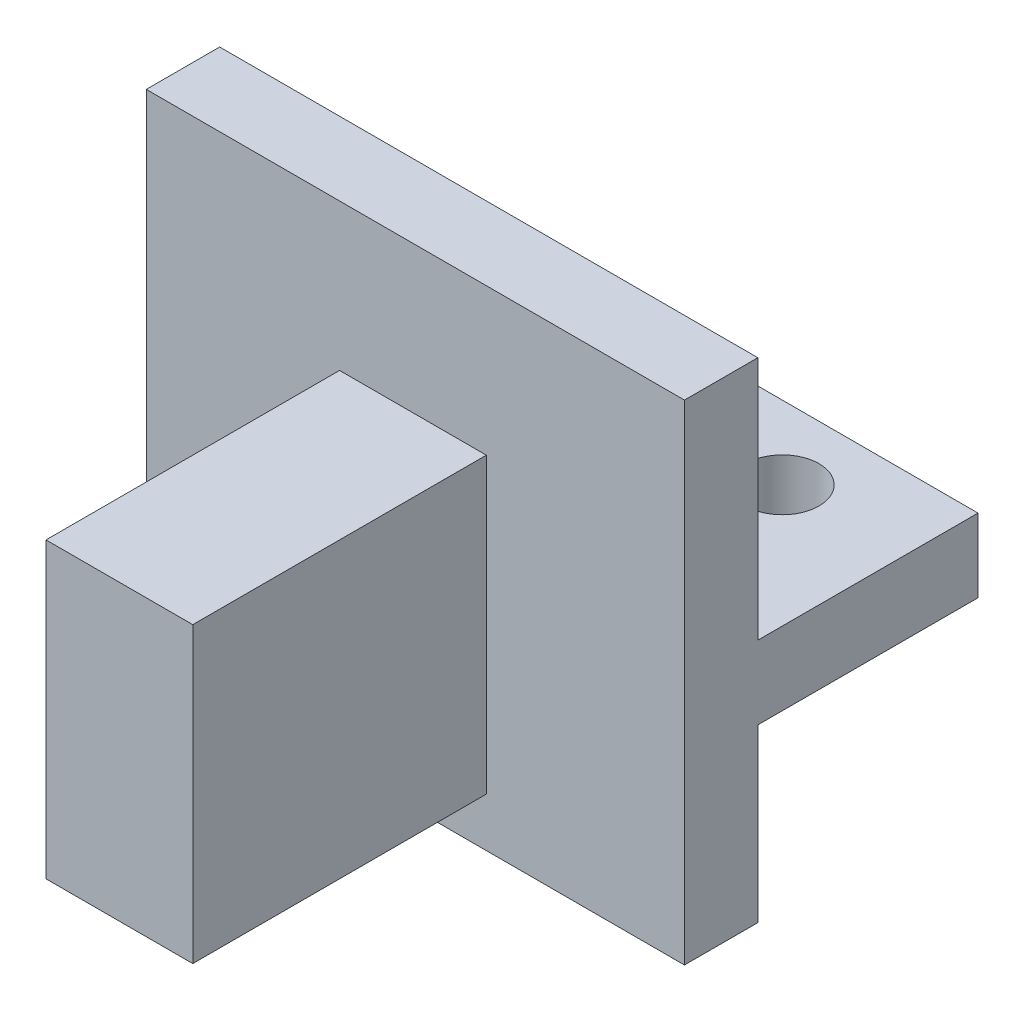
ISO-10303-21;
HEADER;
FILE_DESCRIPTION(('STEP AP214'),'2;1');
FILE_NAME('part.step','',(''),(''),'','','');
FILE_SCHEMA(('AUTOMOTIVE_DESIGN { 1 0 10303 214 1 1 1 1 }'));
ENDSEC;
DATA;
#1=APPLICATION_CONTEXT('core data for automotive mechanical design processes');
#2=APPLICATION_PROTOCOL_DEFINITION('international standard','automotive_design',2000,#1);
#3=PRODUCT_CONTEXT('',#1,'mechanical');
#4=PRODUCT('Part','Part','',(#3));
#5=PRODUCT_RELATED_PRODUCT_CATEGORY('part','',(#4));
#6=PRODUCT_DEFINITION_FORMATION('','',#4);
#7=PRODUCT_DEFINITION_CONTEXT('part definition',#1,'design');
#8=PRODUCT_DEFINITION('design','',#6,#7);
#9=PRODUCT_DEFINITION_SHAPE('','',#8);
#10=(LENGTH_UNIT() NAMED_UNIT(*) SI_UNIT(.MILLI.,.METRE.));
#11=(NAMED_UNIT(*) PLANE_ANGLE_UNIT() SI_UNIT($,.RADIAN.));
#12=(NAMED_UNIT(*) SI_UNIT($,.STERADIAN.) SOLID_ANGLE_UNIT());
#13=UNCERTAINTY_MEASURE_WITH_UNIT(LENGTH_MEASURE(1.E-05),#10,'distance_accuracy_value','');
#14=(GEOMETRIC_REPRESENTATION_CONTEXT(3) GLOBAL_UNCERTAINTY_ASSIGNED_CONTEXT((#13)) GLOBAL_UNIT_ASSIGNED_CONTEXT((#10,
#11,#12)) REPRESENTATION_CONTEXT('',''));
#15=CARTESIAN_POINT('',(0.,0.,0.));
#16=DIRECTION('',(0.,0.,1.));
#17=DIRECTION('',(1.,0.,0.));
#18=AXIS2_PLACEMENT_3D('',#15,#16,#17);
#19=CARTESIAN_POINT('',(0.,0.,0.));
#20=DIRECTION('',(0.,1.,0.));
#21=DIRECTION('',(0.,0.,1.));
#22=AXIS2_PLACEMENT_3D('',#19,#20,#21);
#23=PLANE('',#22);
#24=CARTESIAN_POINT('',(8.10927835051547,0.,1.19381443298969));
#25=DIRECTION('',(0.,1.,0.));
#26=DIRECTION('',(0.,0.,-1.));
#27=AXIS2_PLACEMENT_3D('',#24,#25,#26);
#28=CIRCLE('',#27,1.5);
#29=CARTESIAN_POINT('',(8.10927835051547,0.,-0.306185567010309));
#30=VERTEX_POINT('',#29);
#31=EDGE_CURVE('E191',#30,#30,#28,.T.);
#32=ORIENTED_EDGE('',*,*,#31,.T.);
#33=EDGE_LOOP('',(#32));
#34=FACE_BOUND('',#33,.T.);
#35=CARTESIAN_POINT('',(-3.89072164948454,0.,1.19381443298969));
#36=DIRECTION('',(0.,1.,0.));
#37=DIRECTION('',(0.,0.,1.));
#38=AXIS2_PLACEMENT_3D('',#35,#36,#37);
#39=CIRCLE('',#38,1.5);
#40=CARTESIAN_POINT('',(-3.89072164948454,0.,2.69381443298969));
#41=VERTEX_POINT('',#40);
#42=EDGE_CURVE('E195',#41,#41,#39,.T.);
#43=ORIENTED_EDGE('',*,*,#42,.T.);
#44=EDGE_LOOP('',(#43));
#45=FACE_BOUND('',#44,.T.);
#46=DIRECTION('',(1.,0.,0.));
#47=VECTOR('',#46,1.);
#48=CARTESIAN_POINT('',(-8.89072164948453,0.,7.19381443298969));
#49=LINE('',#48,#47);
#50=CARTESIAN_POINT('',(-8.89072164948453,0.,7.19381443298969));
#51=VERTEX_POINT('',#50);
#52=CARTESIAN_POINT('',(13.1092783505155,0.,7.19381443298969));
#53=VERTEX_POINT('',#52);
#54=EDGE_CURVE('E143',#51,#53,#49,.T.);
#55=ORIENTED_EDGE('',*,*,#54,.F.);
#56=DIRECTION('',(0.,0.,1.));
#57=VECTOR('',#56,1.);
#58=CARTESIAN_POINT('',(-8.89072164948453,0.,-1.80618556701031));
#59=LINE('',#58,#57);
#60=CARTESIAN_POINT('',(-8.89072164948453,0.,-1.80618556701031));
#61=VERTEX_POINT('',#60);
#62=EDGE_CURVE('E201',#61,#51,#59,.T.);
#63=ORIENTED_EDGE('',*,*,#62,.F.);
#64=DIRECTION('',(-1.,0.,0.));
#65=VECTOR('',#64,1.);
#66=CARTESIAN_POINT('',(-8.89072164948453,0.,-1.80618556701031));
#67=LINE('',#66,#65);
#68=CARTESIAN_POINT('',(13.1092783505155,0.,-1.80618556701031));
#69=VERTEX_POINT('',#68);
#70=EDGE_CURVE('E207',#69,#61,#67,.T.);
#71=ORIENTED_EDGE('',*,*,#70,.F.);
#72=DIRECTION('',(0.,0.,-1.));
#73=VECTOR('',#72,1.);
#74=CARTESIAN_POINT('',(13.1092783505155,0.,-1.80618556701031));
#75=LINE('',#74,#73);
#76=EDGE_CURVE('E213',#53,#69,#75,.T.);
#77=ORIENTED_EDGE('',*,*,#76,.F.);
#78=EDGE_LOOP('',(#55,#63,#71,#77));
#79=FACE_BOUND('',#78,.T.);
#80=ADVANCED_FACE('F33',(#34,#45,#79),#23,.F.);
#81=CARTESIAN_POINT('',(0.,3.,0.));
#82=DIRECTION('',(0.,1.,0.));
#83=DIRECTION('',(0.,0.,1.));
#84=AXIS2_PLACEMENT_3D('',#81,#82,#83);
#85=PLANE('',#84);
#86=DIRECTION('',(-1.,0.,0.));
#87=VECTOR('',#86,1.);
#88=CARTESIAN_POINT('',(-8.89072164948453,3.,7.19381443298969));
#89=LINE('',#88,#87);
#90=CARTESIAN_POINT('',(13.1092783505155,3.,7.19381443298969));
#91=VERTEX_POINT('',#90);
#92=CARTESIAN_POINT('',(-8.89072164948453,3.,7.19381443298969));
#93=VERTEX_POINT('',#92);
#94=EDGE_CURVE('E168',#91,#93,#89,.T.);
#95=ORIENTED_EDGE('',*,*,#94,.F.);
#96=DIRECTION('',(0.,0.,-1.));
#97=VECTOR('',#96,1.);
#98=CARTESIAN_POINT('',(13.1092783505155,3.,-1.80618556701031));
#99=LINE('',#98,#97);
#100=CARTESIAN_POINT('',(13.1092783505155,3.,-1.80618556701031));
#101=VERTEX_POINT('',#100);
#102=EDGE_CURVE('E206',#91,#101,#99,.T.);
#103=ORIENTED_EDGE('',*,*,#102,.T.);
#104=DIRECTION('',(-1.,0.,0.));
#105=VECTOR('',#104,1.);
#106=CARTESIAN_POINT('',(-8.89072164948453,3.,-1.80618556701031));
#107=LINE('',#106,#105);
#108=CARTESIAN_POINT('',(-8.89072164948453,3.,-1.80618556701031));
#109=VERTEX_POINT('',#108);
#110=EDGE_CURVE('E209',#101,#109,#107,.T.);
#111=ORIENTED_EDGE('',*,*,#110,.T.);
#112=DIRECTION('',(0.,0.,1.));
#113=VECTOR('',#112,1.);
#114=CARTESIAN_POINT('',(-8.89072164948453,3.,-1.80618556701031));
#115=LINE('',#114,#113);
#116=EDGE_CURVE('E204',#109,#93,#115,.T.);
#117=ORIENTED_EDGE('',*,*,#116,.T.);
#118=EDGE_LOOP('',(#95,#103,#111,#117));
#119=FACE_BOUND('',#118,.T.);
#120=CARTESIAN_POINT('',(-3.89072164948454,3.,1.19381443298969));
#121=DIRECTION('',(0.,1.,0.));
#122=DIRECTION('',(0.,0.,1.));
#123=AXIS2_PLACEMENT_3D('',#120,#121,#122);
#124=CIRCLE('',#123,1.5);
#125=CARTESIAN_POINT('',(-3.89072164948454,3.,2.69381443298969));
#126=VERTEX_POINT('',#125);
#127=EDGE_CURVE('E198',#126,#126,#124,.T.);
#128=ORIENTED_EDGE('',*,*,#127,.F.);
#129=EDGE_LOOP('',(#128));
#130=FACE_BOUND('',#129,.T.);
#131=CARTESIAN_POINT('',(8.10927835051547,3.,1.19381443298969));
#132=DIRECTION('',(0.,1.,0.));
#133=DIRECTION('',(0.,0.,-1.));
#134=AXIS2_PLACEMENT_3D('',#131,#132,#133);
#135=CIRCLE('',#134,1.5);
#136=CARTESIAN_POINT('',(8.10927835051547,3.,-0.306185567010309));
#137=VERTEX_POINT('',#136);
#138=EDGE_CURVE('E192',#137,#137,#135,.T.);
#139=ORIENTED_EDGE('',*,*,#138,.F.);
#140=EDGE_LOOP('',(#139));
#141=FACE_BOUND('',#140,.T.);
#142=ADVANCED_FACE('F250',(#119,#130,#141),#85,.T.);
#143=CARTESIAN_POINT('',(-8.89072164948453,3.,-1.80618556701031));
#144=DIRECTION('',(1.,0.,0.));
#145=DIRECTION('',(0.,0.,-1.));
#146=AXIS2_PLACEMENT_3D('',#143,#144,#145);
#147=PLANE('',#146);
#148=ORIENTED_EDGE('',*,*,#62,.T.);
#149=DIRECTION('',(0.,1.,0.));
#150=VECTOR('',#149,1.);
#151=CARTESIAN_POINT('',(-8.89072164948453,-7.,7.19381443298969));
#152=LINE('',#151,#150);
#153=CARTESIAN_POINT('',(-8.89072164948453,-7.,7.19381443298969));
#154=VERTEX_POINT('',#153);
#155=EDGE_CURVE('E165',#154,#51,#152,.T.);
#156=ORIENTED_EDGE('',*,*,#155,.F.);
#157=DIRECTION('',(0.,0.,-1.));
#158=VECTOR('',#157,1.);
#159=CARTESIAN_POINT('',(-8.89072164948453,-7.,10.1938144329897));
#160=LINE('',#159,#158);
#161=CARTESIAN_POINT('',(-8.89072164948453,-7.,10.1938144329897));
#162=VERTEX_POINT('',#161);
#163=EDGE_CURVE('E146',#162,#154,#160,.T.);
#164=ORIENTED_EDGE('',*,*,#163,.F.);
#165=DIRECTION('',(0.,-1.,0.));
#166=VECTOR('',#165,1.);
#167=CARTESIAN_POINT('',(-8.89072164948453,3.,10.1938144329897));
#168=LINE('',#167,#166);
#169=CARTESIAN_POINT('',(-8.89072164948453,13.,10.1938144329897));
#170=VERTEX_POINT('',#169);
#171=EDGE_CURVE('E187',#170,#162,#168,.T.);
#172=ORIENTED_EDGE('',*,*,#171,.F.);
#173=DIRECTION('',(0.,0.,1.));
#174=VECTOR('',#173,1.);
#175=CARTESIAN_POINT('',(-8.89072164948453,13.,10.1938144329897));
#176=LINE('',#175,#174);
#177=CARTESIAN_POINT('',(-8.89072164948453,13.,7.19381443298969));
#178=VERTEX_POINT('',#177);
#179=EDGE_CURVE('E169',#178,#170,#176,.T.);
#180=ORIENTED_EDGE('',*,*,#179,.F.);
#181=DIRECTION('',(0.,-1.,0.));
#182=VECTOR('',#181,1.);
#183=CARTESIAN_POINT('',(-8.89072164948453,13.,7.19381443298969));
#184=LINE('',#183,#182);
#185=EDGE_CURVE('E179',#178,#93,#184,.T.);
#186=ORIENTED_EDGE('',*,*,#185,.T.);
#187=ORIENTED_EDGE('',*,*,#116,.F.);
#188=DIRECTION('',(0.,-1.,0.));
#189=VECTOR('',#188,1.);
#190=CARTESIAN_POINT('',(-8.89072164948453,3.,-1.80618556701031));
#191=LINE('',#190,#189);
#192=EDGE_CURVE('E41',#109,#61,#191,.T.);
#193=ORIENTED_EDGE('',*,*,#192,.T.);
#194=EDGE_LOOP('',(#148,#156,#164,#172,#180,#186,#187,#193));
#195=FACE_BOUND('',#194,.T.);
#196=ADVANCED_FACE('F35',(#195),#147,.F.);
#197=CARTESIAN_POINT('',(13.1092783505155,3.,-1.80618556701031));
#198=DIRECTION('',(-1.,0.,0.));
#199=DIRECTION('',(0.,0.,1.));
#200=AXIS2_PLACEMENT_3D('',#197,#198,#199);
#201=PLANE('',#200);
#202=DIRECTION('',(0.,1.,0.));
#203=VECTOR('',#202,1.);
#204=CARTESIAN_POINT('',(13.1092783505155,3.,10.1938144329897));
#205=LINE('',#204,#203);
#206=CARTESIAN_POINT('',(13.1092783505155,-7.,10.1938144329897));
#207=VERTEX_POINT('',#206);
#208=CARTESIAN_POINT('',(13.1092783505155,13.,10.1938144329897));
#209=VERTEX_POINT('',#208);
#210=EDGE_CURVE('E189',#207,#209,#205,.T.);
#211=ORIENTED_EDGE('',*,*,#210,.F.);
#212=DIRECTION('',(0.,0.,1.));
#213=VECTOR('',#212,1.);
#214=CARTESIAN_POINT('',(13.1092783505155,-7.,10.1938144329897));
#215=LINE('',#214,#213);
#216=CARTESIAN_POINT('',(13.1092783505155,-7.,7.19381443298969));
#217=VERTEX_POINT('',#216);
#218=EDGE_CURVE('E156',#217,#207,#215,.T.);
#219=ORIENTED_EDGE('',*,*,#218,.F.);
#220=DIRECTION('',(0.,1.,0.));
#221=VECTOR('',#220,1.);
#222=CARTESIAN_POINT('',(13.1092783505155,-7.,7.19381443298969));
#223=LINE('',#222,#221);
#224=EDGE_CURVE('E161',#217,#53,#223,.T.);
#225=ORIENTED_EDGE('',*,*,#224,.T.);
#226=ORIENTED_EDGE('',*,*,#76,.T.);
#227=DIRECTION('',(0.,-1.,0.));
#228=VECTOR('',#227,1.);
#229=CARTESIAN_POINT('',(13.1092783505155,3.,-1.80618556701031));
#230=LINE('',#229,#228);
#231=EDGE_CURVE('E11',#101,#69,#230,.T.);
#232=ORIENTED_EDGE('',*,*,#231,.F.);
#233=ORIENTED_EDGE('',*,*,#102,.F.);
#234=DIRECTION('',(0.,-1.,0.));
#235=VECTOR('',#234,1.);
#236=CARTESIAN_POINT('',(13.1092783505155,13.,7.19381443298969));
#237=LINE('',#236,#235);
#238=CARTESIAN_POINT('',(13.1092783505155,13.,7.19381443298969));
#239=VERTEX_POINT('',#238);
#240=EDGE_CURVE('E184',#239,#91,#237,.T.);
#241=ORIENTED_EDGE('',*,*,#240,.F.);
#242=DIRECTION('',(0.,0.,-1.));
#243=VECTOR('',#242,1.);
#244=CARTESIAN_POINT('',(13.1092783505155,13.,10.1938144329897));
#245=LINE('',#244,#243);
#246=EDGE_CURVE('E175',#209,#239,#245,.T.);
#247=ORIENTED_EDGE('',*,*,#246,.F.);
#248=EDGE_LOOP('',(#211,#219,#225,#226,#232,#233,#241,#247));
#249=FACE_BOUND('',#248,.T.);
#250=ADVANCED_FACE('F230',(#249),#201,.F.);
#251=CARTESIAN_POINT('',(-8.89072164948453,3.,-1.80618556701031));
#252=DIRECTION('',(0.,0.,1.));
#253=DIRECTION('',(1.,0.,0.));
#254=AXIS2_PLACEMENT_3D('',#251,#252,#253);
#255=PLANE('',#254);
#256=ORIENTED_EDGE('',*,*,#70,.T.);
#257=ORIENTED_EDGE('',*,*,#192,.F.);
#258=ORIENTED_EDGE('',*,*,#110,.F.);
#259=ORIENTED_EDGE('',*,*,#231,.T.);
#260=EDGE_LOOP('',(#256,#257,#258,#259));
#261=FACE_BOUND('',#260,.T.);
#262=ADVANCED_FACE('F252',(#261),#255,.F.);
#263=CARTESIAN_POINT('',(-3.89072164948454,3.,1.19381443298969));
#264=DIRECTION('',(0.,-1.,0.));
#265=DIRECTION('',(0.,0.,-1.));
#266=AXIS2_PLACEMENT_3D('',#263,#264,#265);
#267=CYLINDRICAL_SURFACE('',#266,1.5);
#268=ORIENTED_EDGE('',*,*,#127,.T.);
#269=EDGE_LOOP('',(#268));
#270=FACE_BOUND('',#269,.T.);
#271=ORIENTED_EDGE('',*,*,#42,.F.);
#272=EDGE_LOOP('',(#271));
#273=FACE_BOUND('',#272,.T.);
#274=ADVANCED_FACE('F254',(#270,#273),#267,.F.);
#275=CARTESIAN_POINT('',(8.10927835051547,3.,1.19381443298969));
#276=DIRECTION('',(0.,-1.,0.));
#277=DIRECTION('',(0.,0.,-1.));
#278=AXIS2_PLACEMENT_3D('',#275,#276,#277);
#279=CYLINDRICAL_SURFACE('',#278,1.5);
#280=ORIENTED_EDGE('',*,*,#138,.T.);
#281=EDGE_LOOP('',(#280));
#282=FACE_BOUND('',#281,.T.);
#283=ORIENTED_EDGE('',*,*,#31,.F.);
#284=EDGE_LOOP('',(#283));
#285=FACE_BOUND('',#284,.T.);
#286=ADVANCED_FACE('F260',(#282,#285),#279,.F.);
#287=CARTESIAN_POINT('',(0.,0.,10.1938144329897));
#288=DIRECTION('',(0.,0.,1.));
#289=DIRECTION('',(1.,0.,0.));
#290=AXIS2_PLACEMENT_3D('',#287,#288,#289);
#291=PLANE('',#290);
#292=DIRECTION('',(0.,1.,0.));
#293=VECTOR('',#292,1.);
#294=CARTESIAN_POINT('',(5.00980223780724,-5.,10.1938144329897));
#295=LINE('',#294,#293);
#296=CARTESIAN_POINT('',(5.00980223780724,-5.,10.1938144329897));
#297=VERTEX_POINT('',#296);
#298=CARTESIAN_POINT('',(5.00980223780724,7.,10.1938144329897));
#299=VERTEX_POINT('',#298);
#300=EDGE_CURVE('E48',#297,#299,#295,.T.);
#301=ORIENTED_EDGE('',*,*,#300,.F.);
#302=DIRECTION('',(-1.,0.,0.));
#303=VECTOR('',#302,1.);
#304=CARTESIAN_POINT('',(5.00980223780724,-5.,10.1938144329897));
#305=LINE('',#304,#303);
#306=CARTESIAN_POINT('',(-0.990197762192765,-5.,10.1938144329897));
#307=VERTEX_POINT('',#306);
#308=EDGE_CURVE('E53',#297,#307,#305,.T.);
#309=ORIENTED_EDGE('',*,*,#308,.T.);
#310=DIRECTION('',(0.,1.,0.));
#311=VECTOR('',#310,1.);
#312=CARTESIAN_POINT('',(-0.990197762192765,-5.,10.1938144329897));
#313=LINE('',#312,#311);
#314=CARTESIAN_POINT('',(-0.990197762192765,7.,10.1938144329897));
#315=VERTEX_POINT('',#314);
#316=EDGE_CURVE('E429',#307,#315,#313,.T.);
#317=ORIENTED_EDGE('',*,*,#316,.T.);
#318=DIRECTION('',(-1.,0.,0.));
#319=VECTOR('',#318,1.);
#320=CARTESIAN_POINT('',(5.00980223780724,7.,10.1938144329897));
#321=LINE('',#320,#319);
#322=EDGE_CURVE('E431',#299,#315,#321,.T.);
#323=ORIENTED_EDGE('',*,*,#322,.F.);
#324=EDGE_LOOP('',(#301,#309,#317,#323));
#325=FACE_BOUND('',#324,.T.);
#326=ORIENTED_EDGE('',*,*,#171,.T.);
#327=DIRECTION('',(-1.,0.,0.));
#328=VECTOR('',#327,1.);
#329=CARTESIAN_POINT('',(-8.89072164948453,-7.,10.1938144329897));
#330=LINE('',#329,#328);
#331=EDGE_CURVE('E159',#207,#162,#330,.T.);
#332=ORIENTED_EDGE('',*,*,#331,.F.);
#333=ORIENTED_EDGE('',*,*,#210,.T.);
#334=DIRECTION('',(1.,0.,0.));
#335=VECTOR('',#334,1.);
#336=CARTESIAN_POINT('',(-8.89072164948453,13.,10.1938144329897));
#337=LINE('',#336,#335);
#338=EDGE_CURVE('E172',#170,#209,#337,.T.);
#339=ORIENTED_EDGE('',*,*,#338,.F.);
#340=EDGE_LOOP('',(#326,#332,#333,#339));
#341=FACE_BOUND('',#340,.T.);
#342=ADVANCED_FACE('F238',(#325,#341),#291,.T.);
#343=CARTESIAN_POINT('',(-8.89072164948453,13.,7.19381443298969));
#344=DIRECTION('',(0.,0.,1.));
#345=DIRECTION('',(1.,0.,0.));
#346=AXIS2_PLACEMENT_3D('',#343,#344,#345);
#347=PLANE('',#346);
#348=ORIENTED_EDGE('',*,*,#94,.T.);
#349=ORIENTED_EDGE('',*,*,#185,.F.);
#350=DIRECTION('',(-1.,0.,0.));
#351=VECTOR('',#350,1.);
#352=CARTESIAN_POINT('',(-8.89072164948453,13.,7.19381443298969));
#353=LINE('',#352,#351);
#354=EDGE_CURVE('E177',#239,#178,#353,.T.);
#355=ORIENTED_EDGE('',*,*,#354,.F.);
#356=ORIENTED_EDGE('',*,*,#240,.T.);
#357=EDGE_LOOP('',(#348,#349,#355,#356));
#358=FACE_BOUND('',#357,.T.);
#359=ADVANCED_FACE('F247',(#358),#347,.F.);
#360=CARTESIAN_POINT('',(0.,13.,0.));
#361=DIRECTION('',(0.,-1.,0.));
#362=DIRECTION('',(0.,0.,-1.));
#363=AXIS2_PLACEMENT_3D('',#360,#361,#362);
#364=PLANE('',#363);
#365=ORIENTED_EDGE('',*,*,#179,.T.);
#366=ORIENTED_EDGE('',*,*,#338,.T.);
#367=ORIENTED_EDGE('',*,*,#246,.T.);
#368=ORIENTED_EDGE('',*,*,#354,.T.);
#369=EDGE_LOOP('',(#365,#366,#367,#368));
#370=FACE_BOUND('',#369,.T.);
#371=ADVANCED_FACE('F243',(#370),#364,.F.);
#372=CARTESIAN_POINT('',(-8.89072164948453,-7.,7.19381443298969));
#373=DIRECTION('',(0.,0.,1.));
#374=DIRECTION('',(1.,0.,0.));
#375=AXIS2_PLACEMENT_3D('',#372,#373,#374);
#376=PLANE('',#375);
#377=ORIENTED_EDGE('',*,*,#54,.T.);
#378=ORIENTED_EDGE('',*,*,#224,.F.);
#379=DIRECTION('',(1.,0.,0.));
#380=VECTOR('',#379,1.);
#381=CARTESIAN_POINT('',(-8.89072164948453,-7.,7.19381443298969));
#382=LINE('',#381,#380);
#383=EDGE_CURVE('E154',#154,#217,#382,.T.);
#384=ORIENTED_EDGE('',*,*,#383,.F.);
#385=ORIENTED_EDGE('',*,*,#155,.T.);
#386=EDGE_LOOP('',(#377,#378,#384,#385));
#387=FACE_BOUND('',#386,.T.);
#388=ADVANCED_FACE('F227',(#387),#376,.F.);
#389=CARTESIAN_POINT('',(0.,-7.,0.));
#390=DIRECTION('',(0.,-1.,0.));
#391=DIRECTION('',(0.,0.,-1.));
#392=AXIS2_PLACEMENT_3D('',#389,#390,#391);
#393=PLANE('',#392);
#394=ORIENTED_EDGE('',*,*,#163,.T.);
#395=ORIENTED_EDGE('',*,*,#383,.T.);
#396=ORIENTED_EDGE('',*,*,#218,.T.);
#397=ORIENTED_EDGE('',*,*,#331,.T.);
#398=EDGE_LOOP('',(#394,#395,#396,#397));
#399=FACE_BOUND('',#398,.T.);
#400=ADVANCED_FACE('F235',(#399),#393,.T.);
#401=CARTESIAN_POINT('',(5.00980223780724,-5.,22.1938144329897));
#402=DIRECTION('',(-1.,0.,0.));
#403=DIRECTION('',(0.,0.,1.));
#404=AXIS2_PLACEMENT_3D('',#401,#402,#403);
#405=PLANE('',#404);
#406=ORIENTED_EDGE('',*,*,#300,.T.);
#407=DIRECTION('',(0.,0.,-1.));
#408=VECTOR('',#407,1.);
#409=CARTESIAN_POINT('',(5.00980223780724,7.,22.1938144329897));
#410=LINE('',#409,#408);
#411=CARTESIAN_POINT('',(5.00980223780724,7.,22.1938144329897));
#412=VERTEX_POINT('',#411);
#413=EDGE_CURVE('E126',#412,#299,#410,.T.);
#414=ORIENTED_EDGE('',*,*,#413,.F.);
#415=DIRECTION('',(0.,1.,0.));
#416=VECTOR('',#415,1.);
#417=CARTESIAN_POINT('',(5.00980223780724,-5.,22.1938144329897));
#418=LINE('',#417,#416);
#419=CARTESIAN_POINT('',(5.00980223780724,-5.,22.1938144329897));
#420=VERTEX_POINT('',#419);
#421=EDGE_CURVE('E133',#420,#412,#418,.T.);
#422=ORIENTED_EDGE('',*,*,#421,.F.);
#423=DIRECTION('',(0.,0.,-1.));
#424=VECTOR('',#423,1.);
#425=CARTESIAN_POINT('',(5.00980223780724,-5.,22.1938144329897));
#426=LINE('',#425,#424);
#427=EDGE_CURVE('E427',#420,#297,#426,.T.);
#428=ORIENTED_EDGE('',*,*,#427,.T.);
#429=EDGE_LOOP('',(#406,#414,#422,#428));
#430=FACE_BOUND('',#429,.T.);
#431=ADVANCED_FACE('F142',(#430),#405,.F.);
#432=CARTESIAN_POINT('',(5.00980223780724,7.,22.1938144329897));
#433=DIRECTION('',(0.,-1.,0.));
#434=DIRECTION('',(0.,0.,-1.));
#435=AXIS2_PLACEMENT_3D('',#432,#433,#434);
#436=PLANE('',#435);
#437=ORIENTED_EDGE('',*,*,#322,.T.);
#438=DIRECTION('',(0.,0.,-1.));
#439=VECTOR('',#438,1.);
#440=CARTESIAN_POINT('',(-0.990197762192765,7.,22.1938144329897));
#441=LINE('',#440,#439);
#442=CARTESIAN_POINT('',(-0.990197762192765,7.,22.1938144329897));
#443=VERTEX_POINT('',#442);
#444=EDGE_CURVE('E128',#443,#315,#441,.T.);
#445=ORIENTED_EDGE('',*,*,#444,.F.);
#446=DIRECTION('',(-1.,0.,0.));
#447=VECTOR('',#446,1.);
#448=CARTESIAN_POINT('',(5.00980223780724,7.,22.1938144329897));
#449=LINE('',#448,#447);
#450=EDGE_CURVE('E121',#412,#443,#449,.T.);
#451=ORIENTED_EDGE('',*,*,#450,.F.);
#452=ORIENTED_EDGE('',*,*,#413,.T.);
#453=EDGE_LOOP('',(#437,#445,#451,#452));
#454=FACE_BOUND('',#453,.T.);
#455=ADVANCED_FACE('F124',(#454),#436,.F.);
#456=CARTESIAN_POINT('',(-0.990197762192765,-5.,22.1938144329897));
#457=DIRECTION('',(-1.,0.,0.));
#458=DIRECTION('',(0.,0.,1.));
#459=AXIS2_PLACEMENT_3D('',#456,#457,#458);
#460=PLANE('',#459);
#461=ORIENTED_EDGE('',*,*,#316,.F.);
#462=DIRECTION('',(0.,0.,-1.));
#463=VECTOR('',#462,1.);
#464=CARTESIAN_POINT('',(-0.990197762192765,-5.,22.1938144329897));
#465=LINE('',#464,#463);
#466=CARTESIAN_POINT('',(-0.990197762192765,-5.,22.1938144329897));
#467=VERTEX_POINT('',#466);
#468=EDGE_CURVE('E148',#467,#307,#465,.T.);
#469=ORIENTED_EDGE('',*,*,#468,.F.);
#470=DIRECTION('',(0.,1.,0.));
#471=VECTOR('',#470,1.);
#472=CARTESIAN_POINT('',(-0.990197762192765,-5.,22.1938144329897));
#473=LINE('',#472,#471);
#474=EDGE_CURVE('E132',#467,#443,#473,.T.);
#475=ORIENTED_EDGE('',*,*,#474,.T.);
#476=ORIENTED_EDGE('',*,*,#444,.T.);
#477=EDGE_LOOP('',(#461,#469,#475,#476));
#478=FACE_BOUND('',#477,.T.);
#479=ADVANCED_FACE('F289',(#478),#460,.T.);
#480=CARTESIAN_POINT('',(5.00980223780724,-5.,22.1938144329897));
#481=DIRECTION('',(0.,-1.,0.));
#482=DIRECTION('',(0.,0.,-1.));
#483=AXIS2_PLACEMENT_3D('',#480,#481,#482);
#484=PLANE('',#483);
#485=ORIENTED_EDGE('',*,*,#308,.F.);
#486=ORIENTED_EDGE('',*,*,#427,.F.);
#487=DIRECTION('',(-1.,0.,0.));
#488=VECTOR('',#487,1.);
#489=CARTESIAN_POINT('',(5.00980223780724,-5.,22.1938144329897));
#490=LINE('',#489,#488);
#491=EDGE_CURVE('E139',#420,#467,#490,.T.);
#492=ORIENTED_EDGE('',*,*,#491,.T.);
#493=ORIENTED_EDGE('',*,*,#468,.T.);
#494=EDGE_LOOP('',(#485,#486,#492,#493));
#495=FACE_BOUND('',#494,.T.);
#496=ADVANCED_FACE('F292',(#495),#484,.T.);
#497=CARTESIAN_POINT('',(0.,0.,22.1938144329897));
#498=DIRECTION('',(0.,0.,1.));
#499=DIRECTION('',(1.,0.,0.));
#500=AXIS2_PLACEMENT_3D('',#497,#498,#499);
#501=PLANE('',#500);
#502=ORIENTED_EDGE('',*,*,#421,.T.);
#503=ORIENTED_EDGE('',*,*,#450,.T.);
#504=ORIENTED_EDGE('',*,*,#474,.F.);
#505=ORIENTED_EDGE('',*,*,#491,.F.);
#506=EDGE_LOOP('',(#502,#503,#504,#505));
#507=FACE_BOUND('',#506,.T.);
#508=ADVANCED_FACE('F137',(#507),#501,.T.);
#509=CLOSED_SHELL('',(#80,#142,#196,#250,#262,#274,#286,#342,#359,#371,#388,#400,#431,#455,#479,
#496,#508));
#510=MANIFOLD_SOLID_BREP('B2',#509);
#511=ADVANCED_BREP_SHAPE_REPRESENTATION('',(#18,#510),#14);
#512=SHAPE_DEFINITION_REPRESENTATION(#9,#511);
ENDSEC;
END-ISO-10303-21;
